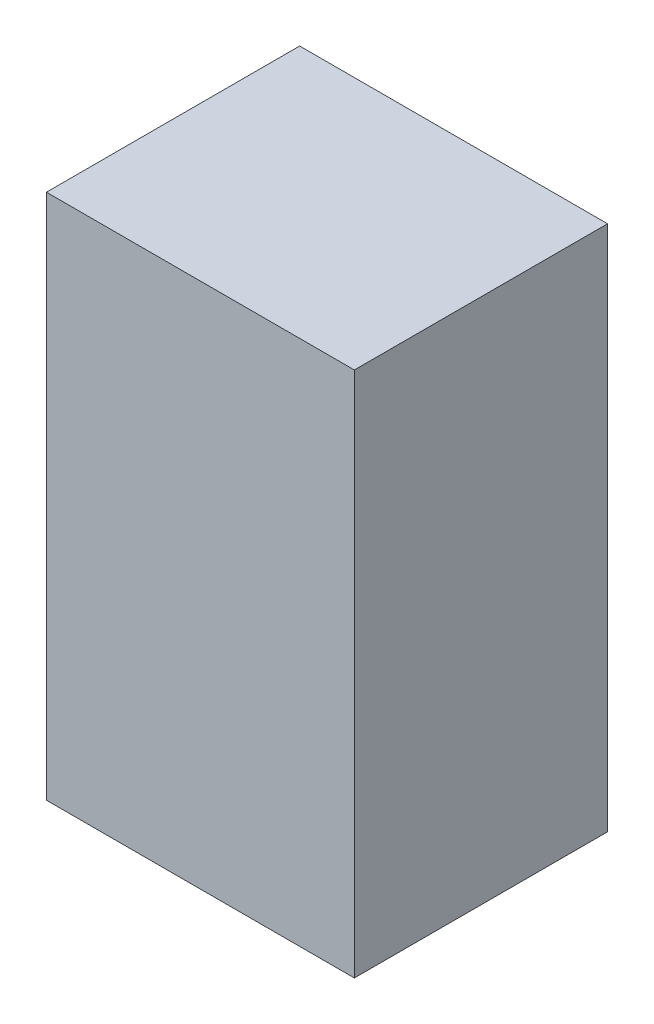
ISO-10303-21;
HEADER;
FILE_DESCRIPTION(('STEP AP214'),'2;1');
FILE_NAME('part.step','',(''),(''),'','','');
FILE_SCHEMA(('AUTOMOTIVE_DESIGN { 1 0 10303 214 1 1 1 1 }'));
ENDSEC;
DATA;
#1=APPLICATION_CONTEXT('core data for automotive mechanical design processes');
#2=APPLICATION_PROTOCOL_DEFINITION('international standard','automotive_design',2000,#1);
#3=PRODUCT_CONTEXT('',#1,'mechanical');
#4=PRODUCT('Part','Part','',(#3));
#5=PRODUCT_RELATED_PRODUCT_CATEGORY('part','',(#4));
#6=PRODUCT_DEFINITION_FORMATION('','',#4);
#7=PRODUCT_DEFINITION_CONTEXT('part definition',#1,'design');
#8=PRODUCT_DEFINITION('design','',#6,#7);
#9=PRODUCT_DEFINITION_SHAPE('','',#8);
#10=(LENGTH_UNIT() NAMED_UNIT(*) SI_UNIT(.MILLI.,.METRE.));
#11=(NAMED_UNIT(*) PLANE_ANGLE_UNIT() SI_UNIT($,.RADIAN.));
#12=(NAMED_UNIT(*) SI_UNIT($,.STERADIAN.) SOLID_ANGLE_UNIT());
#13=UNCERTAINTY_MEASURE_WITH_UNIT(LENGTH_MEASURE(1.E-05),#10,'distance_accuracy_value','');
#14=(GEOMETRIC_REPRESENTATION_CONTEXT(3) GLOBAL_UNCERTAINTY_ASSIGNED_CONTEXT((#13)) GLOBAL_UNIT_ASSIGNED_CONTEXT((#10,
#11,#12)) REPRESENTATION_CONTEXT('',''));
#15=CARTESIAN_POINT('',(0.,0.,0.));
#16=DIRECTION('',(0.,0.,1.));
#17=DIRECTION('',(1.,0.,0.));
#18=AXIS2_PLACEMENT_3D('',#15,#16,#17);
#19=CARTESIAN_POINT('',(-0.6079998,-1.0397998,1.00000054));
#20=DIRECTION('',(0.,0.,1.));
#21=DIRECTION('',(1.,0.,0.));
#22=AXIS2_PLACEMENT_3D('',#19,#20,#21);
#23=PLANE('',#22);
#24=DIRECTION('',(-1.,0.,0.));
#25=VECTOR('',#24,1.);
#26=CARTESIAN_POINT('',(0.60800234,-1.0397998,1.00000054));
#27=LINE('',#26,#25);
#28=CARTESIAN_POINT('',(0.60800234,-1.0397998,1.00000054));
#29=VERTEX_POINT('',#28);
#30=CARTESIAN_POINT('',(-0.6079998,-1.0397998,1.00000054));
#31=VERTEX_POINT('',#30);
#32=EDGE_CURVE('E27',#29,#31,#27,.T.);
#33=ORIENTED_EDGE('',*,*,#32,.F.);
#34=DIRECTION('',(-1.22138896208531E-06,-0.999999999999254,0.));
#35=VECTOR('',#34,1.);
#36=CARTESIAN_POINT('',(0.60800488,1.0397998,1.00000054));
#37=LINE('',#36,#35);
#38=CARTESIAN_POINT('',(0.60800488,1.0397998,1.00000054));
#39=VERTEX_POINT('',#38);
#40=EDGE_CURVE('E20',#39,#29,#37,.T.);
#41=ORIENTED_EDGE('',*,*,#40,.F.);
#42=DIRECTION('',(1.,0.,0.));
#43=VECTOR('',#42,1.);
#44=CARTESIAN_POINT('',(-0.60800234,1.0397998,1.00000054));
#45=LINE('',#44,#43);
#46=CARTESIAN_POINT('',(-0.60800234,1.0397998,1.00000054));
#47=VERTEX_POINT('',#46);
#48=EDGE_CURVE('E68',#47,#39,#45,.T.);
#49=ORIENTED_EDGE('',*,*,#48,.F.);
#50=DIRECTION('',(-1.22138896208531E-06,0.999999999999254,0.));
#51=VECTOR('',#50,1.);
#52=CARTESIAN_POINT('',(-0.6079998,-1.0397998,1.00000054));
#53=LINE('',#52,#51);
#54=EDGE_CURVE('E99',#31,#47,#53,.T.);
#55=ORIENTED_EDGE('',*,*,#54,.F.);
#56=EDGE_LOOP('',(#33,#41,#49,#55));
#57=FACE_BOUND('',#56,.T.);
#58=ADVANCED_FACE('F16',(#57),#23,.T.);
#59=CARTESIAN_POINT('',(-0.6079998,-1.0397998,0.));
#60=DIRECTION('',(0.,0.,1.));
#61=DIRECTION('',(1.,0.,0.));
#62=AXIS2_PLACEMENT_3D('',#59,#60,#61);
#63=PLANE('',#62);
#64=DIRECTION('',(-1.22138896208531E-06,0.999999999999254,0.));
#65=VECTOR('',#64,1.);
#66=CARTESIAN_POINT('',(-0.6079998,-1.0397998,0.));
#67=LINE('',#66,#65);
#68=CARTESIAN_POINT('',(-0.6079998,-1.0397998,0.));
#69=VERTEX_POINT('',#68);
#70=CARTESIAN_POINT('',(-0.60800234,1.0397998,0.));
#71=VERTEX_POINT('',#70);
#72=EDGE_CURVE('E89',#69,#71,#67,.T.);
#73=ORIENTED_EDGE('',*,*,#72,.T.);
#74=DIRECTION('',(1.,0.,0.));
#75=VECTOR('',#74,1.);
#76=CARTESIAN_POINT('',(-0.60800234,1.0397998,0.));
#77=LINE('',#76,#75);
#78=CARTESIAN_POINT('',(0.60800488,1.0397998,0.));
#79=VERTEX_POINT('',#78);
#80=EDGE_CURVE('E75',#71,#79,#77,.T.);
#81=ORIENTED_EDGE('',*,*,#80,.T.);
#82=DIRECTION('',(-1.22138896208531E-06,-0.999999999999254,0.));
#83=VECTOR('',#82,1.);
#84=CARTESIAN_POINT('',(0.60800488,1.0397998,0.));
#85=LINE('',#84,#83);
#86=CARTESIAN_POINT('',(0.60800234,-1.0397998,0.));
#87=VERTEX_POINT('',#86);
#88=EDGE_CURVE('E79',#79,#87,#85,.T.);
#89=ORIENTED_EDGE('',*,*,#88,.T.);
#90=DIRECTION('',(-1.,0.,0.));
#91=VECTOR('',#90,1.);
#92=CARTESIAN_POINT('',(0.60800234,-1.0397998,0.));
#93=LINE('',#92,#91);
#94=EDGE_CURVE('E11',#87,#69,#93,.T.);
#95=ORIENTED_EDGE('',*,*,#94,.T.);
#96=EDGE_LOOP('',(#73,#81,#89,#95));
#97=FACE_BOUND('',#96,.T.);
#98=ADVANCED_FACE('F18',(#97),#63,.F.);
#99=CARTESIAN_POINT('',(0.60800234,-1.0397998,0.));
#100=DIRECTION('',(0.,-1.,0.));
#101=DIRECTION('',(0.,0.,-1.));
#102=AXIS2_PLACEMENT_3D('',#99,#100,#101);
#103=PLANE('',#102);
#104=DIRECTION('',(0.,0.,1.));
#105=VECTOR('',#104,1.);
#106=CARTESIAN_POINT('',(0.60800234,-1.0397998,0.));
#107=LINE('',#106,#105);
#108=EDGE_CURVE('E74',#87,#29,#107,.T.);
#109=ORIENTED_EDGE('',*,*,#108,.T.);
#110=ORIENTED_EDGE('',*,*,#32,.T.);
#111=DIRECTION('',(0.,0.,1.));
#112=VECTOR('',#111,1.);
#113=CARTESIAN_POINT('',(-0.6079998,-1.0397998,0.));
#114=LINE('',#113,#112);
#115=EDGE_CURVE('E102',#69,#31,#114,.T.);
#116=ORIENTED_EDGE('',*,*,#115,.F.);
#117=ORIENTED_EDGE('',*,*,#94,.F.);
#118=EDGE_LOOP('',(#109,#110,#116,#117));
#119=FACE_BOUND('',#118,.T.);
#120=ADVANCED_FACE('F121',(#119),#103,.T.);
#121=CARTESIAN_POINT('',(0.60800488,1.0397998,0.));
#122=DIRECTION('',(0.999999999999254,-1.22138896208531E-06,0.));
#123=DIRECTION('',(0.,0.,-1.));
#124=AXIS2_PLACEMENT_3D('',#121,#122,#123);
#125=PLANE('',#124);
#126=DIRECTION('',(0.,0.,1.));
#127=VECTOR('',#126,1.);
#128=CARTESIAN_POINT('',(0.60800488,1.0397998,0.));
#129=LINE('',#128,#127);
#130=EDGE_CURVE('E77',#79,#39,#129,.T.);
#131=ORIENTED_EDGE('',*,*,#130,.T.);
#132=ORIENTED_EDGE('',*,*,#40,.T.);
#133=ORIENTED_EDGE('',*,*,#108,.F.);
#134=ORIENTED_EDGE('',*,*,#88,.F.);
#135=EDGE_LOOP('',(#131,#132,#133,#134));
#136=FACE_BOUND('',#135,.T.);
#137=ADVANCED_FACE('F78',(#136),#125,.T.);
#138=CARTESIAN_POINT('',(-0.60800234,1.0397998,0.));
#139=DIRECTION('',(0.,1.,0.));
#140=DIRECTION('',(1.,0.,0.));
#141=AXIS2_PLACEMENT_3D('',#138,#139,#140);
#142=PLANE('',#141);
#143=DIRECTION('',(0.,0.,1.));
#144=VECTOR('',#143,1.);
#145=CARTESIAN_POINT('',(-0.60800234,1.0397998,0.));
#146=LINE('',#145,#144);
#147=EDGE_CURVE('E86',#71,#47,#146,.T.);
#148=ORIENTED_EDGE('',*,*,#147,.T.);
#149=ORIENTED_EDGE('',*,*,#48,.T.);
#150=ORIENTED_EDGE('',*,*,#130,.F.);
#151=ORIENTED_EDGE('',*,*,#80,.F.);
#152=EDGE_LOOP('',(#148,#149,#150,#151));
#153=FACE_BOUND('',#152,.T.);
#154=ADVANCED_FACE('F84',(#153),#142,.T.);
#155=CARTESIAN_POINT('',(-0.6079998,-1.0397998,0.));
#156=DIRECTION('',(-0.999999999999254,-1.22138896208531E-06,0.));
#157=DIRECTION('',(-1.22138896208531E-06,0.999999999999254,0.));
#158=AXIS2_PLACEMENT_3D('',#155,#156,#157);
#159=PLANE('',#158);
#160=ORIENTED_EDGE('',*,*,#115,.T.);
#161=ORIENTED_EDGE('',*,*,#54,.T.);
#162=ORIENTED_EDGE('',*,*,#147,.F.);
#163=ORIENTED_EDGE('',*,*,#72,.F.);
#164=EDGE_LOOP('',(#160,#161,#162,#163));
#165=FACE_BOUND('',#164,.T.);
#166=ADVANCED_FACE('F118',(#165),#159,.T.);
#167=CLOSED_SHELL('',(#58,#98,#120,#137,#154,#166));
#168=MANIFOLD_SOLID_BREP('B1',#167);
#169=ADVANCED_BREP_SHAPE_REPRESENTATION('',(#18,#168),#14);
#170=SHAPE_DEFINITION_REPRESENTATION(#9,#169);
ENDSEC;
END-ISO-10303-21;
